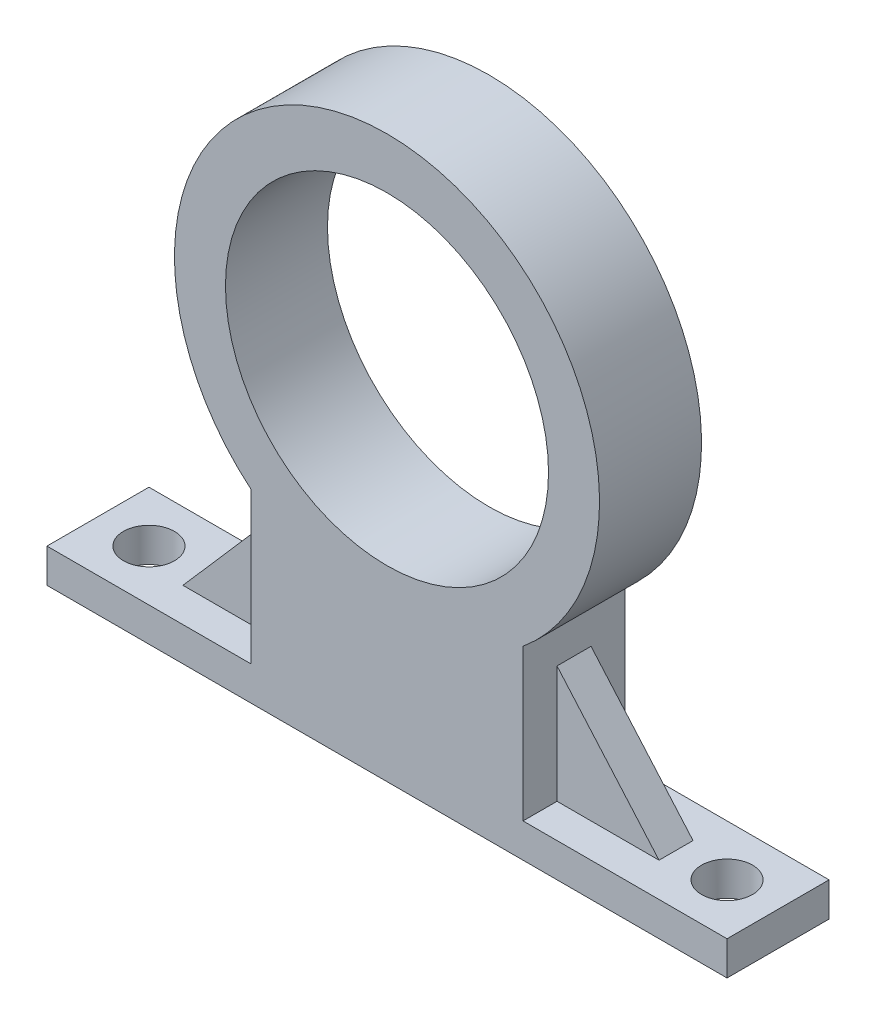
ISO-10303-21;
HEADER;
FILE_DESCRIPTION(('STEP AP214'),'2;1');
FILE_NAME('part.step','',(''),(''),'','','');
FILE_SCHEMA(('AUTOMOTIVE_DESIGN { 1 0 10303 214 1 1 1 1 }'));
ENDSEC;
DATA;
#1=APPLICATION_CONTEXT('core data for automotive mechanical design processes');
#2=APPLICATION_PROTOCOL_DEFINITION('international standard','automotive_design',2000,#1);
#3=PRODUCT_CONTEXT('',#1,'mechanical');
#4=PRODUCT('Part','Part','',(#3));
#5=PRODUCT_RELATED_PRODUCT_CATEGORY('part','',(#4));
#6=PRODUCT_DEFINITION_FORMATION('','',#4);
#7=PRODUCT_DEFINITION_CONTEXT('part definition',#1,'design');
#8=PRODUCT_DEFINITION('design','',#6,#7);
#9=PRODUCT_DEFINITION_SHAPE('','',#8);
#10=(LENGTH_UNIT() NAMED_UNIT(*) SI_UNIT(.MILLI.,.METRE.));
#11=(NAMED_UNIT(*) PLANE_ANGLE_UNIT() SI_UNIT($,.RADIAN.));
#12=(NAMED_UNIT(*) SI_UNIT($,.STERADIAN.) SOLID_ANGLE_UNIT());
#13=UNCERTAINTY_MEASURE_WITH_UNIT(LENGTH_MEASURE(1.E-05),#10,'distance_accuracy_value','');
#14=(GEOMETRIC_REPRESENTATION_CONTEXT(3) GLOBAL_UNCERTAINTY_ASSIGNED_CONTEXT((#13)) GLOBAL_UNIT_ASSIGNED_CONTEXT((#10,
#11,#12)) REPRESENTATION_CONTEXT('',''));
#15=CARTESIAN_POINT('',(0.,0.,0.));
#16=DIRECTION('',(0.,0.,1.));
#17=DIRECTION('',(1.,0.,0.));
#18=AXIS2_PLACEMENT_3D('',#15,#16,#17);
#19=CARTESIAN_POINT('',(8.,-20.5,0.));
#20=DIRECTION('',(-1.,0.,0.));
#21=DIRECTION('',(0.,0.,1.));
#22=AXIS2_PLACEMENT_3D('',#19,#20,#21);
#23=PLANE('',#22);
#24=DIRECTION('',(0.,0.,1.));
#25=VECTOR('',#24,1.);
#26=CARTESIAN_POINT('',(8.,-11.6046863561493,2.));
#27=LINE('',#26,#25);
#28=CARTESIAN_POINT('',(8.,-11.6046863561493,2.));
#29=VERTEX_POINT('',#28);
#30=CARTESIAN_POINT('',(8.,-11.6046863561493,4.));
#31=VERTEX_POINT('',#30);
#32=EDGE_CURVE('E58',#29,#31,#27,.T.);
#33=ORIENTED_EDGE('',*,*,#32,.F.);
#34=DIRECTION('',(0.,-1.,0.));
#35=VECTOR('',#34,1.);
#36=CARTESIAN_POINT('',(8.,-11.6046863561493,2.));
#37=LINE('',#36,#35);
#38=CARTESIAN_POINT('',(8.,-18.5,2.));
#39=VERTEX_POINT('',#38);
#40=EDGE_CURVE('E324',#29,#39,#37,.T.);
#41=ORIENTED_EDGE('',*,*,#40,.T.);
#42=DIRECTION('',(0.,0.,1.));
#43=VECTOR('',#42,1.);
#44=CARTESIAN_POINT('',(8.,-18.5,6.));
#45=LINE('',#44,#43);
#46=CARTESIAN_POINT('',(8.,-18.5,0.));
#47=VERTEX_POINT('',#46);
#48=EDGE_CURVE('E175',#47,#39,#45,.T.);
#49=ORIENTED_EDGE('',*,*,#48,.F.);
#50=DIRECTION('',(0.,1.,0.));
#51=VECTOR('',#50,1.);
#52=CARTESIAN_POINT('',(8.,-20.5,0.));
#53=LINE('',#52,#51);
#54=CARTESIAN_POINT('',(8.,-9.60468635614927,0.));
#55=VERTEX_POINT('',#54);
#56=EDGE_CURVE('E199',#47,#55,#53,.T.);
#57=ORIENTED_EDGE('',*,*,#56,.T.);
#58=DIRECTION('',(0.,0.,-1.));
#59=VECTOR('',#58,1.);
#60=CARTESIAN_POINT('',(8.,-9.60468635614927,6.));
#61=LINE('',#60,#59);
#62=CARTESIAN_POINT('',(8.,-9.60468635614927,6.));
#63=VERTEX_POINT('',#62);
#64=EDGE_CURVE('E189',#55,#63,#61,.F.);
#65=ORIENTED_EDGE('',*,*,#64,.T.);
#66=DIRECTION('',(0.,1.,0.));
#67=VECTOR('',#66,1.);
#68=CARTESIAN_POINT('',(8.,-20.5,6.));
#69=LINE('',#68,#67);
#70=CARTESIAN_POINT('',(8.,-18.5,6.));
#71=VERTEX_POINT('',#70);
#72=EDGE_CURVE('E205',#71,#63,#69,.T.);
#73=ORIENTED_EDGE('',*,*,#72,.F.);
#74=CARTESIAN_POINT('',(8.,-18.5,4.));
#75=VERTEX_POINT('',#74);
#76=EDGE_CURVE('E170',#75,#71,#45,.T.);
#77=ORIENTED_EDGE('',*,*,#76,.F.);
#78=DIRECTION('',(0.,-1.,0.));
#79=VECTOR('',#78,1.);
#80=CARTESIAN_POINT('',(8.,-11.6046863561493,4.));
#81=LINE('',#80,#79);
#82=EDGE_CURVE('E317',#31,#75,#81,.T.);
#83=ORIENTED_EDGE('',*,*,#82,.F.);
#84=EDGE_LOOP('',(#33,#41,#49,#57,#65,#73,#77,#83));
#85=FACE_BOUND('',#84,.T.);
#86=ADVANCED_FACE('F35',(#85),#23,.F.);
#87=CARTESIAN_POINT('',(0.,0.,6.));
#88=DIRECTION('',(0.,0.,-1.));
#89=DIRECTION('',(-1.,0.,0.));
#90=AXIS2_PLACEMENT_3D('',#87,#88,#89);
#91=CYLINDRICAL_SURFACE('',#90,12.5);
#92=ORIENTED_EDGE('',*,*,#64,.F.);
#93=CARTESIAN_POINT('',(0.,0.,0.));
#94=DIRECTION('',(0.,0.,1.));
#95=DIRECTION('',(1.,0.,0.));
#96=AXIS2_PLACEMENT_3D('',#93,#94,#95);
#97=CIRCLE('',#96,12.5);
#98=CARTESIAN_POINT('',(-8.,-9.60468635614928,0.));
#99=VERTEX_POINT('',#98);
#100=EDGE_CURVE('E39',#55,#99,#97,.T.);
#101=ORIENTED_EDGE('',*,*,#100,.T.);
#102=DIRECTION('',(0.,0.,-1.));
#103=VECTOR('',#102,1.);
#104=CARTESIAN_POINT('',(-8.,-9.60468635614928,6.));
#105=LINE('',#104,#103);
#106=CARTESIAN_POINT('',(-8.,-9.60468635614928,6.));
#107=VERTEX_POINT('',#106);
#108=EDGE_CURVE('E192',#107,#99,#105,.T.);
#109=ORIENTED_EDGE('',*,*,#108,.F.);
#110=CARTESIAN_POINT('',(0.,0.,6.));
#111=DIRECTION('',(0.,0.,1.));
#112=DIRECTION('',(1.,0.,0.));
#113=AXIS2_PLACEMENT_3D('',#110,#111,#112);
#114=CIRCLE('',#113,12.5);
#115=EDGE_CURVE('E11',#63,#107,#114,.T.);
#116=ORIENTED_EDGE('',*,*,#115,.F.);
#117=EDGE_LOOP('',(#92,#101,#109,#116));
#118=FACE_BOUND('',#117,.T.);
#119=ADVANCED_FACE('F37',(#118),#91,.T.);
#120=CARTESIAN_POINT('',(0.,0.,6.));
#121=DIRECTION('',(0.,0.,1.));
#122=DIRECTION('',(1.,0.,0.));
#123=AXIS2_PLACEMENT_3D('',#120,#121,#122);
#124=PLANE('',#123);
#125=ORIENTED_EDGE('',*,*,#115,.T.);
#126=DIRECTION('',(0.,1.,0.));
#127=VECTOR('',#126,1.);
#128=CARTESIAN_POINT('',(-8.,-20.5,6.));
#129=LINE('',#128,#127);
#130=CARTESIAN_POINT('',(-8.,-18.5,6.));
#131=VERTEX_POINT('',#130);
#132=EDGE_CURVE('E203',#131,#107,#129,.T.);
#133=ORIENTED_EDGE('',*,*,#132,.F.);
#134=DIRECTION('',(1.,0.,0.));
#135=VECTOR('',#134,1.);
#136=CARTESIAN_POINT('',(-20.,-18.5,6.));
#137=LINE('',#136,#135);
#138=CARTESIAN_POINT('',(-20.,-18.5,6.));
#139=VERTEX_POINT('',#138);
#140=EDGE_CURVE('E156',#139,#131,#137,.T.);
#141=ORIENTED_EDGE('',*,*,#140,.F.);
#142=DIRECTION('',(0.,-1.,0.));
#143=VECTOR('',#142,1.);
#144=CARTESIAN_POINT('',(-20.,-20.5,6.));
#145=LINE('',#144,#143);
#146=CARTESIAN_POINT('',(-20.,-20.5,6.));
#147=VERTEX_POINT('',#146);
#148=EDGE_CURVE('E160',#139,#147,#145,.T.);
#149=ORIENTED_EDGE('',*,*,#148,.T.);
#150=DIRECTION('',(-1.,0.,0.));
#151=VECTOR('',#150,1.);
#152=CARTESIAN_POINT('',(-8.,-20.5,6.));
#153=LINE('',#152,#151);
#154=CARTESIAN_POINT('',(20.,-20.5,6.));
#155=VERTEX_POINT('',#154);
#156=EDGE_CURVE('E195',#155,#147,#153,.T.);
#157=ORIENTED_EDGE('',*,*,#156,.F.);
#158=DIRECTION('',(0.,-1.,0.));
#159=VECTOR('',#158,1.);
#160=CARTESIAN_POINT('',(20.,-20.5,6.));
#161=LINE('',#160,#159);
#162=CARTESIAN_POINT('',(20.,-18.5,6.));
#163=VERTEX_POINT('',#162);
#164=EDGE_CURVE('E171',#163,#155,#161,.T.);
#165=ORIENTED_EDGE('',*,*,#164,.F.);
#166=DIRECTION('',(-1.,0.,0.));
#167=VECTOR('',#166,1.);
#168=CARTESIAN_POINT('',(20.,-18.5,6.));
#169=LINE('',#168,#167);
#170=EDGE_CURVE('E182',#163,#71,#169,.T.);
#171=ORIENTED_EDGE('',*,*,#170,.T.);
#172=ORIENTED_EDGE('',*,*,#72,.T.);
#173=EDGE_LOOP('',(#125,#133,#141,#149,#157,#165,#171,#172));
#174=FACE_BOUND('',#173,.T.);
#175=CARTESIAN_POINT('',(0.,0.,6.));
#176=DIRECTION('',(0.,0.,1.));
#177=DIRECTION('',(1.,0.,0.));
#178=AXIS2_PLACEMENT_3D('',#175,#176,#177);
#179=CIRCLE('',#178,9.5);
#180=CARTESIAN_POINT('',(9.5,0.,6.));
#181=VERTEX_POINT('',#180);
#182=EDGE_CURVE('E208',#181,#181,#179,.T.);
#183=ORIENTED_EDGE('',*,*,#182,.F.);
#184=EDGE_LOOP('',(#183));
#185=FACE_BOUND('',#184,.T.);
#186=ADVANCED_FACE('F226',(#174,#185),#124,.T.);
#187=CARTESIAN_POINT('',(0.,0.,0.));
#188=DIRECTION('',(0.,0.,1.));
#189=DIRECTION('',(1.,0.,0.));
#190=AXIS2_PLACEMENT_3D('',#187,#188,#189);
#191=PLANE('',#190);
#192=ORIENTED_EDGE('',*,*,#100,.F.);
#193=ORIENTED_EDGE('',*,*,#56,.F.);
#194=DIRECTION('',(-1.,0.,0.));
#195=VECTOR('',#194,1.);
#196=CARTESIAN_POINT('',(20.,-18.5,0.));
#197=LINE('',#196,#195);
#198=CARTESIAN_POINT('',(20.,-18.5,0.));
#199=VERTEX_POINT('',#198);
#200=EDGE_CURVE('E187',#199,#47,#197,.T.);
#201=ORIENTED_EDGE('',*,*,#200,.F.);
#202=DIRECTION('',(0.,1.,0.));
#203=VECTOR('',#202,1.);
#204=CARTESIAN_POINT('',(20.,-20.5,0.));
#205=LINE('',#204,#203);
#206=CARTESIAN_POINT('',(20.,-20.5,0.));
#207=VERTEX_POINT('',#206);
#208=EDGE_CURVE('E178',#207,#199,#205,.T.);
#209=ORIENTED_EDGE('',*,*,#208,.F.);
#210=DIRECTION('',(1.,0.,0.));
#211=VECTOR('',#210,1.);
#212=CARTESIAN_POINT('',(-8.,-20.5,0.));
#213=LINE('',#212,#211);
#214=CARTESIAN_POINT('',(-20.,-20.5,0.));
#215=VERTEX_POINT('',#214);
#216=EDGE_CURVE('E197',#215,#207,#213,.T.);
#217=ORIENTED_EDGE('',*,*,#216,.F.);
#218=DIRECTION('',(0.,1.,0.));
#219=VECTOR('',#218,1.);
#220=CARTESIAN_POINT('',(-20.,-20.5,0.));
#221=LINE('',#220,#219);
#222=CARTESIAN_POINT('',(-20.,-18.5,0.));
#223=VERTEX_POINT('',#222);
#224=EDGE_CURVE('E330',#215,#223,#221,.T.);
#225=ORIENTED_EDGE('',*,*,#224,.T.);
#226=DIRECTION('',(1.,0.,0.));
#227=VECTOR('',#226,1.);
#228=CARTESIAN_POINT('',(-20.,-18.5,0.));
#229=LINE('',#228,#227);
#230=CARTESIAN_POINT('',(-8.,-18.5,0.));
#231=VERTEX_POINT('',#230);
#232=EDGE_CURVE('E167',#223,#231,#229,.T.);
#233=ORIENTED_EDGE('',*,*,#232,.T.);
#234=DIRECTION('',(0.,1.,0.));
#235=VECTOR('',#234,1.);
#236=CARTESIAN_POINT('',(-8.,-20.5,0.));
#237=LINE('',#236,#235);
#238=EDGE_CURVE('E201',#231,#99,#237,.T.);
#239=ORIENTED_EDGE('',*,*,#238,.T.);
#240=EDGE_LOOP('',(#192,#193,#201,#209,#217,#225,#233,#239));
#241=FACE_BOUND('',#240,.T.);
#242=CARTESIAN_POINT('',(0.,0.,0.));
#243=DIRECTION('',(0.,0.,1.));
#244=DIRECTION('',(1.,0.,0.));
#245=AXIS2_PLACEMENT_3D('',#242,#243,#244);
#246=CIRCLE('',#245,9.5);
#247=CARTESIAN_POINT('',(9.5,0.,0.));
#248=VERTEX_POINT('',#247);
#249=EDGE_CURVE('E207',#248,#248,#246,.T.);
#250=ORIENTED_EDGE('',*,*,#249,.T.);
#251=EDGE_LOOP('',(#250));
#252=FACE_BOUND('',#251,.T.);
#253=ADVANCED_FACE('F214',(#241,#252),#191,.F.);
#254=CARTESIAN_POINT('',(0.,0.,6.));
#255=DIRECTION('',(0.,0.,-1.));
#256=DIRECTION('',(-1.,0.,0.));
#257=AXIS2_PLACEMENT_3D('',#254,#255,#256);
#258=CYLINDRICAL_SURFACE('',#257,9.5);
#259=ORIENTED_EDGE('',*,*,#182,.T.);
#260=EDGE_LOOP('',(#259));
#261=FACE_BOUND('',#260,.T.);
#262=ORIENTED_EDGE('',*,*,#249,.F.);
#263=EDGE_LOOP('',(#262));
#264=FACE_BOUND('',#263,.T.);
#265=ADVANCED_FACE('F216',(#261,#264),#258,.F.);
#266=CARTESIAN_POINT('',(-8.,-20.5,0.));
#267=DIRECTION('',(1.,0.,0.));
#268=DIRECTION('',(0.,0.,-1.));
#269=AXIS2_PLACEMENT_3D('',#266,#267,#268);
#270=PLANE('',#269);
#271=DIRECTION('',(0.,0.,1.));
#272=VECTOR('',#271,1.);
#273=CARTESIAN_POINT('',(-8.,-18.5,6.));
#274=LINE('',#273,#272);
#275=CARTESIAN_POINT('',(-8.,-18.5,2.));
#276=VERTEX_POINT('',#275);
#277=EDGE_CURVE('E158',#231,#276,#274,.T.);
#278=ORIENTED_EDGE('',*,*,#277,.T.);
#279=DIRECTION('',(0.,-1.,0.));
#280=VECTOR('',#279,1.);
#281=CARTESIAN_POINT('',(-8.,-11.6046863561493,2.));
#282=LINE('',#281,#280);
#283=CARTESIAN_POINT('',(-8.,-11.6046863561493,2.));
#284=VERTEX_POINT('',#283);
#285=EDGE_CURVE('E304',#284,#276,#282,.T.);
#286=ORIENTED_EDGE('',*,*,#285,.F.);
#287=DIRECTION('',(0.,0.,1.));
#288=VECTOR('',#287,1.);
#289=CARTESIAN_POINT('',(-8.,-11.6046863561493,2.));
#290=LINE('',#289,#288);
#291=CARTESIAN_POINT('',(-8.,-11.6046863561493,4.));
#292=VERTEX_POINT('',#291);
#293=EDGE_CURVE('E151',#284,#292,#290,.T.);
#294=ORIENTED_EDGE('',*,*,#293,.T.);
#295=DIRECTION('',(0.,-1.,0.));
#296=VECTOR('',#295,1.);
#297=CARTESIAN_POINT('',(-8.,-11.6046863561493,4.));
#298=LINE('',#297,#296);
#299=CARTESIAN_POINT('',(-8.,-18.5,4.));
#300=VERTEX_POINT('',#299);
#301=EDGE_CURVE('E137',#292,#300,#298,.T.);
#302=ORIENTED_EDGE('',*,*,#301,.T.);
#303=EDGE_CURVE('E147',#300,#131,#274,.T.);
#304=ORIENTED_EDGE('',*,*,#303,.T.);
#305=ORIENTED_EDGE('',*,*,#132,.T.);
#306=ORIENTED_EDGE('',*,*,#108,.T.);
#307=ORIENTED_EDGE('',*,*,#238,.F.);
#308=EDGE_LOOP('',(#278,#286,#294,#302,#304,#305,#306,#307));
#309=FACE_BOUND('',#308,.T.);
#310=ADVANCED_FACE('F146',(#309),#270,.F.);
#311=CARTESIAN_POINT('',(0.,-20.5,0.));
#312=DIRECTION('',(0.,1.,0.));
#313=DIRECTION('',(0.,0.,1.));
#314=AXIS2_PLACEMENT_3D('',#311,#312,#313);
#315=PLANE('',#314);
#316=CARTESIAN_POINT('',(-17.,-20.5,3.));
#317=DIRECTION('',(0.,1.,0.));
#318=DIRECTION('',(0.,0.,1.));
#319=AXIS2_PLACEMENT_3D('',#316,#317,#318);
#320=CIRCLE('',#319,1.5);
#321=CARTESIAN_POINT('',(-17.,-20.5,4.5));
#322=VERTEX_POINT('',#321);
#323=EDGE_CURVE('E141',#322,#322,#320,.F.);
#324=ORIENTED_EDGE('',*,*,#323,.F.);
#325=EDGE_LOOP('',(#324));
#326=FACE_BOUND('',#325,.T.);
#327=CARTESIAN_POINT('',(17.,-20.5,3.));
#328=DIRECTION('',(0.,1.,0.));
#329=DIRECTION('',(0.,0.,1.));
#330=AXIS2_PLACEMENT_3D('',#327,#328,#329);
#331=CIRCLE('',#330,1.5);
#332=CARTESIAN_POINT('',(17.,-20.5,4.5));
#333=VERTEX_POINT('',#332);
#334=EDGE_CURVE('E292',#333,#333,#331,.F.);
#335=ORIENTED_EDGE('',*,*,#334,.F.);
#336=EDGE_LOOP('',(#335));
#337=FACE_BOUND('',#336,.T.);
#338=ORIENTED_EDGE('',*,*,#216,.T.);
#339=DIRECTION('',(0.,0.,-1.));
#340=VECTOR('',#339,1.);
#341=CARTESIAN_POINT('',(20.,-20.5,6.));
#342=LINE('',#341,#340);
#343=EDGE_CURVE('E174',#155,#207,#342,.T.);
#344=ORIENTED_EDGE('',*,*,#343,.F.);
#345=ORIENTED_EDGE('',*,*,#156,.T.);
#346=DIRECTION('',(0.,0.,-1.));
#347=VECTOR('',#346,1.);
#348=CARTESIAN_POINT('',(-20.,-20.5,6.));
#349=LINE('',#348,#347);
#350=EDGE_CURVE('E165',#147,#215,#349,.T.);
#351=ORIENTED_EDGE('',*,*,#350,.T.);
#352=EDGE_LOOP('',(#338,#344,#345,#351));
#353=FACE_BOUND('',#352,.T.);
#354=ADVANCED_FACE('F224',(#326,#337,#353),#315,.F.);
#355=CARTESIAN_POINT('',(20.,-18.5,6.));
#356=DIRECTION('',(0.,-1.,0.));
#357=DIRECTION('',(0.,0.,-1.));
#358=AXIS2_PLACEMENT_3D('',#355,#356,#357);
#359=PLANE('',#358);
#360=CARTESIAN_POINT('',(17.,-18.5,3.));
#361=DIRECTION('',(0.,1.,0.));
#362=DIRECTION('',(0.,0.,-1.));
#363=AXIS2_PLACEMENT_3D('',#360,#361,#362);
#364=CIRCLE('',#363,1.5);
#365=CARTESIAN_POINT('',(17.,-18.5,1.5));
#366=VERTEX_POINT('',#365);
#367=EDGE_CURVE('E295',#366,#366,#364,.T.);
#368=ORIENTED_EDGE('',*,*,#367,.F.);
#369=EDGE_LOOP('',(#368));
#370=FACE_BOUND('',#369,.T.);
#371=ORIENTED_EDGE('',*,*,#48,.T.);
#372=DIRECTION('',(1.,0.,0.));
#373=VECTOR('',#372,1.);
#374=CARTESIAN_POINT('',(8.,-18.5,2.));
#375=LINE('',#374,#373);
#376=CARTESIAN_POINT('',(14.,-18.5,2.));
#377=VERTEX_POINT('',#376);
#378=EDGE_CURVE('E320',#39,#377,#375,.T.);
#379=ORIENTED_EDGE('',*,*,#378,.T.);
#380=DIRECTION('',(0.,0.,1.));
#381=VECTOR('',#380,1.);
#382=CARTESIAN_POINT('',(14.,-18.5,2.));
#383=LINE('',#382,#381);
#384=CARTESIAN_POINT('',(14.,-18.5,4.));
#385=VERTEX_POINT('',#384);
#386=EDGE_CURVE('E161',#377,#385,#383,.T.);
#387=ORIENTED_EDGE('',*,*,#386,.T.);
#388=DIRECTION('',(1.,0.,0.));
#389=VECTOR('',#388,1.);
#390=CARTESIAN_POINT('',(8.,-18.5,4.));
#391=LINE('',#390,#389);
#392=EDGE_CURVE('E310',#75,#385,#391,.T.);
#393=ORIENTED_EDGE('',*,*,#392,.F.);
#394=ORIENTED_EDGE('',*,*,#76,.T.);
#395=ORIENTED_EDGE('',*,*,#170,.F.);
#396=DIRECTION('',(0.,0.,1.));
#397=VECTOR('',#396,1.);
#398=CARTESIAN_POINT('',(20.,-18.5,6.));
#399=LINE('',#398,#397);
#400=EDGE_CURVE('E180',#199,#163,#399,.T.);
#401=ORIENTED_EDGE('',*,*,#400,.F.);
#402=ORIENTED_EDGE('',*,*,#200,.T.);
#403=EDGE_LOOP('',(#371,#379,#387,#393,#394,#395,#401,#402));
#404=FACE_BOUND('',#403,.T.);
#405=ADVANCED_FACE('F238',(#370,#404),#359,.F.);
#406=CARTESIAN_POINT('',(20.,0.,0.));
#407=DIRECTION('',(-1.,0.,0.));
#408=DIRECTION('',(0.,0.,1.));
#409=AXIS2_PLACEMENT_3D('',#406,#407,#408);
#410=PLANE('',#409);
#411=ORIENTED_EDGE('',*,*,#164,.T.);
#412=ORIENTED_EDGE('',*,*,#343,.T.);
#413=ORIENTED_EDGE('',*,*,#208,.T.);
#414=ORIENTED_EDGE('',*,*,#400,.T.);
#415=EDGE_LOOP('',(#411,#412,#413,#414));
#416=FACE_BOUND('',#415,.T.);
#417=ADVANCED_FACE('F242',(#416),#410,.F.);
#418=CARTESIAN_POINT('',(-20.,-18.5,6.));
#419=DIRECTION('',(0.,1.,0.));
#420=DIRECTION('',(0.,0.,1.));
#421=AXIS2_PLACEMENT_3D('',#418,#419,#420);
#422=PLANE('',#421);
#423=CARTESIAN_POINT('',(-17.,-18.5,3.));
#424=DIRECTION('',(0.,1.,0.));
#425=DIRECTION('',(0.,0.,1.));
#426=AXIS2_PLACEMENT_3D('',#423,#424,#425);
#427=CIRCLE('',#426,1.5);
#428=CARTESIAN_POINT('',(-17.,-18.5,4.5));
#429=VERTEX_POINT('',#428);
#430=EDGE_CURVE('E288',#429,#429,#427,.T.);
#431=ORIENTED_EDGE('',*,*,#430,.F.);
#432=EDGE_LOOP('',(#431));
#433=FACE_BOUND('',#432,.T.);
#434=DIRECTION('',(-1.,0.,0.));
#435=VECTOR('',#434,1.);
#436=CARTESIAN_POINT('',(-8.,-18.5,2.));
#437=LINE('',#436,#435);
#438=CARTESIAN_POINT('',(-14.,-18.5,2.));
#439=VERTEX_POINT('',#438);
#440=EDGE_CURVE('E301',#276,#439,#437,.T.);
#441=ORIENTED_EDGE('',*,*,#440,.F.);
#442=ORIENTED_EDGE('',*,*,#277,.F.);
#443=ORIENTED_EDGE('',*,*,#232,.F.);
#444=DIRECTION('',(0.,0.,1.));
#445=VECTOR('',#444,1.);
#446=CARTESIAN_POINT('',(-20.,-18.5,6.));
#447=LINE('',#446,#445);
#448=EDGE_CURVE('E329',#223,#139,#447,.T.);
#449=ORIENTED_EDGE('',*,*,#448,.T.);
#450=ORIENTED_EDGE('',*,*,#140,.T.);
#451=ORIENTED_EDGE('',*,*,#303,.F.);
#452=DIRECTION('',(-1.,0.,0.));
#453=VECTOR('',#452,1.);
#454=CARTESIAN_POINT('',(-8.,-18.5,4.));
#455=LINE('',#454,#453);
#456=CARTESIAN_POINT('',(-14.,-18.5,4.));
#457=VERTEX_POINT('',#456);
#458=EDGE_CURVE('E134',#300,#457,#455,.T.);
#459=ORIENTED_EDGE('',*,*,#458,.T.);
#460=DIRECTION('',(0.,0.,1.));
#461=VECTOR('',#460,1.);
#462=CARTESIAN_POINT('',(-14.,-18.5,2.));
#463=LINE('',#462,#461);
#464=EDGE_CURVE('E308',#439,#457,#463,.T.);
#465=ORIENTED_EDGE('',*,*,#464,.F.);
#466=EDGE_LOOP('',(#441,#442,#443,#449,#450,#451,#459,#465));
#467=FACE_BOUND('',#466,.T.);
#468=ADVANCED_FACE('F154',(#433,#467),#422,.T.);
#469=CARTESIAN_POINT('',(-20.,0.,0.));
#470=DIRECTION('',(1.,0.,0.));
#471=DIRECTION('',(0.,0.,1.));
#472=AXIS2_PLACEMENT_3D('',#469,#470,#471);
#473=PLANE('',#472);
#474=ORIENTED_EDGE('',*,*,#148,.F.);
#475=ORIENTED_EDGE('',*,*,#448,.F.);
#476=ORIENTED_EDGE('',*,*,#224,.F.);
#477=ORIENTED_EDGE('',*,*,#350,.F.);
#478=EDGE_LOOP('',(#474,#475,#476,#477));
#479=FACE_BOUND('',#478,.T.);
#480=ADVANCED_FACE('F249',(#479),#473,.F.);
#481=CARTESIAN_POINT('',(14.,-18.5,2.));
#482=DIRECTION('',(0.754384720454159,0.656432550644238,0.));
#483=DIRECTION('',(-0.656432550644238,0.754384720454159,0.));
#484=AXIS2_PLACEMENT_3D('',#481,#482,#483);
#485=PLANE('',#484);
#486=ORIENTED_EDGE('',*,*,#32,.T.);
#487=DIRECTION('',(-0.656432550644238,0.754384720454159,0.));
#488=VECTOR('',#487,1.);
#489=CARTESIAN_POINT('',(14.,-18.5,4.));
#490=LINE('',#489,#488);
#491=EDGE_CURVE('E314',#385,#31,#490,.T.);
#492=ORIENTED_EDGE('',*,*,#491,.F.);
#493=ORIENTED_EDGE('',*,*,#386,.F.);
#494=DIRECTION('',(-0.656432550644238,0.754384720454159,0.));
#495=VECTOR('',#494,1.);
#496=CARTESIAN_POINT('',(14.,-18.5,2.));
#497=LINE('',#496,#495);
#498=EDGE_CURVE('E322',#377,#29,#497,.T.);
#499=ORIENTED_EDGE('',*,*,#498,.T.);
#500=EDGE_LOOP('',(#486,#492,#493,#499));
#501=FACE_BOUND('',#500,.T.);
#502=ADVANCED_FACE('F253',(#501),#485,.T.);
#503=CARTESIAN_POINT('',(0.,0.,2.));
#504=DIRECTION('',(0.,0.,-1.));
#505=DIRECTION('',(-1.,0.,0.));
#506=AXIS2_PLACEMENT_3D('',#503,#504,#505);
#507=PLANE('',#506);
#508=ORIENTED_EDGE('',*,*,#378,.F.);
#509=ORIENTED_EDGE('',*,*,#40,.F.);
#510=ORIENTED_EDGE('',*,*,#498,.F.);
#511=EDGE_LOOP('',(#508,#509,#510));
#512=FACE_BOUND('',#511,.T.);
#513=ADVANCED_FACE('F257',(#512),#507,.T.);
#514=CARTESIAN_POINT('',(0.,0.,4.));
#515=DIRECTION('',(0.,0.,-1.));
#516=DIRECTION('',(-1.,0.,0.));
#517=AXIS2_PLACEMENT_3D('',#514,#515,#516);
#518=PLANE('',#517);
#519=ORIENTED_EDGE('',*,*,#392,.T.);
#520=ORIENTED_EDGE('',*,*,#491,.T.);
#521=ORIENTED_EDGE('',*,*,#82,.T.);
#522=EDGE_LOOP('',(#519,#520,#521));
#523=FACE_BOUND('',#522,.T.);
#524=ADVANCED_FACE('F261',(#523),#518,.F.);
#525=CARTESIAN_POINT('',(-14.,-18.5,2.));
#526=DIRECTION('',(0.754384720454159,-0.656432550644238,0.));
#527=DIRECTION('',(0.656432550644238,0.754384720454159,0.));
#528=AXIS2_PLACEMENT_3D('',#525,#526,#527);
#529=PLANE('',#528);
#530=ORIENTED_EDGE('',*,*,#464,.T.);
#531=DIRECTION('',(0.656432550644238,0.754384720454159,0.));
#532=VECTOR('',#531,1.);
#533=CARTESIAN_POINT('',(-14.,-18.5,4.));
#534=LINE('',#533,#532);
#535=EDGE_CURVE('E50',#457,#292,#534,.T.);
#536=ORIENTED_EDGE('',*,*,#535,.T.);
#537=ORIENTED_EDGE('',*,*,#293,.F.);
#538=DIRECTION('',(0.656432550644238,0.754384720454159,0.));
#539=VECTOR('',#538,1.);
#540=CARTESIAN_POINT('',(-14.,-18.5,2.));
#541=LINE('',#540,#539);
#542=EDGE_CURVE('E306',#439,#284,#541,.T.);
#543=ORIENTED_EDGE('',*,*,#542,.F.);
#544=EDGE_LOOP('',(#530,#536,#537,#543));
#545=FACE_BOUND('',#544,.T.);
#546=ADVANCED_FACE('F265',(#545),#529,.F.);
#547=CARTESIAN_POINT('',(0.,0.,2.));
#548=DIRECTION('',(0.,0.,-1.));
#549=DIRECTION('',(1.,0.,0.));
#550=AXIS2_PLACEMENT_3D('',#547,#548,#549);
#551=PLANE('',#550);
#552=ORIENTED_EDGE('',*,*,#440,.T.);
#553=ORIENTED_EDGE('',*,*,#542,.T.);
#554=ORIENTED_EDGE('',*,*,#285,.T.);
#555=EDGE_LOOP('',(#552,#553,#554));
#556=FACE_BOUND('',#555,.T.);
#557=ADVANCED_FACE('F269',(#556),#551,.T.);
#558=CARTESIAN_POINT('',(0.,0.,4.));
#559=DIRECTION('',(0.,0.,-1.));
#560=DIRECTION('',(1.,0.,0.));
#561=AXIS2_PLACEMENT_3D('',#558,#559,#560);
#562=PLANE('',#561);
#563=ORIENTED_EDGE('',*,*,#458,.F.);
#564=ORIENTED_EDGE('',*,*,#301,.F.);
#565=ORIENTED_EDGE('',*,*,#535,.F.);
#566=EDGE_LOOP('',(#563,#564,#565));
#567=FACE_BOUND('',#566,.T.);
#568=ADVANCED_FACE('F136',(#567),#562,.F.);
#569=CARTESIAN_POINT('',(-17.,-20.501,3.));
#570=DIRECTION('',(0.,1.,0.));
#571=DIRECTION('',(0.,0.,1.));
#572=AXIS2_PLACEMENT_3D('',#569,#570,#571);
#573=CYLINDRICAL_SURFACE('',#572,1.5);
#574=ORIENTED_EDGE('',*,*,#430,.T.);
#575=EDGE_LOOP('',(#574));
#576=FACE_BOUND('',#575,.T.);
#577=ORIENTED_EDGE('',*,*,#323,.T.);
#578=EDGE_LOOP('',(#577));
#579=FACE_BOUND('',#578,.T.);
#580=ADVANCED_FACE('F276',(#576,#579),#573,.F.);
#581=CARTESIAN_POINT('',(17.,-20.501,3.));
#582=DIRECTION('',(0.,1.,0.));
#583=DIRECTION('',(0.,0.,1.));
#584=AXIS2_PLACEMENT_3D('',#581,#582,#583);
#585=CYLINDRICAL_SURFACE('',#584,1.5);
#586=ORIENTED_EDGE('',*,*,#367,.T.);
#587=EDGE_LOOP('',(#586));
#588=FACE_BOUND('',#587,.T.);
#589=ORIENTED_EDGE('',*,*,#334,.T.);
#590=EDGE_LOOP('',(#589));
#591=FACE_BOUND('',#590,.T.);
#592=ADVANCED_FACE('F277',(#588,#591),#585,.F.);
#593=CLOSED_SHELL('',(#86,#119,#186,#253,#265,#310,#354,#405,#417,#468,#480,#502,#513,#524,#546,
#557,#568,#580,#592));
#594=MANIFOLD_SOLID_BREP('B2',#593);
#595=ADVANCED_BREP_SHAPE_REPRESENTATION('',(#18,#594),#14);
#596=SHAPE_DEFINITION_REPRESENTATION(#9,#595);
ENDSEC;
END-ISO-10303-21;
